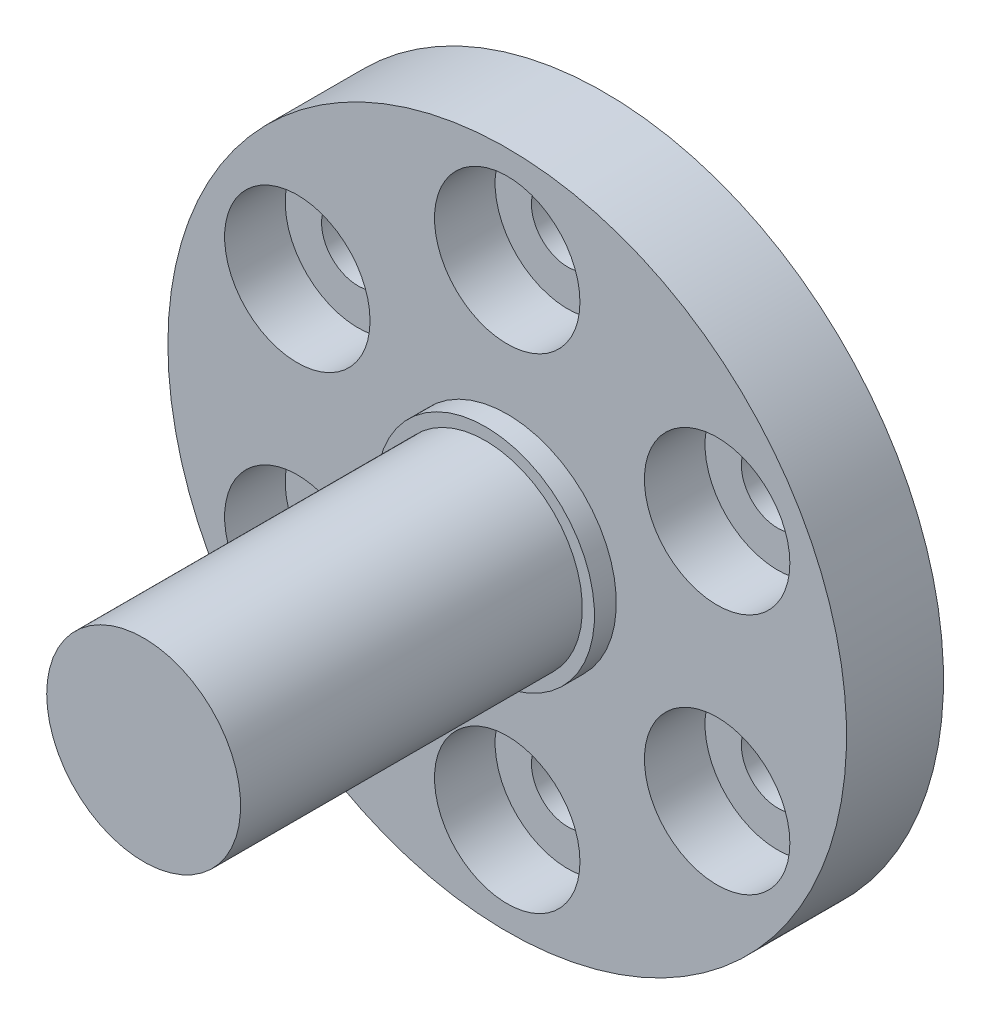
ISO-10303-21;
HEADER;
FILE_DESCRIPTION(('STEP AP214'),'2;1');
FILE_NAME('part.step','',(''),(''),'','','');
FILE_SCHEMA(('AUTOMOTIVE_DESIGN { 1 0 10303 214 1 1 1 1 }'));
ENDSEC;
DATA;
#1=APPLICATION_CONTEXT('core data for automotive mechanical design processes');
#2=APPLICATION_PROTOCOL_DEFINITION('international standard','automotive_design',2000,#1);
#3=PRODUCT_CONTEXT('',#1,'mechanical');
#4=PRODUCT('Part','Part','',(#3));
#5=PRODUCT_RELATED_PRODUCT_CATEGORY('part','',(#4));
#6=PRODUCT_DEFINITION_FORMATION('','',#4);
#7=PRODUCT_DEFINITION_CONTEXT('part definition',#1,'design');
#8=PRODUCT_DEFINITION('design','',#6,#7);
#9=PRODUCT_DEFINITION_SHAPE('','',#8);
#10=(LENGTH_UNIT() NAMED_UNIT(*) SI_UNIT(.MILLI.,.METRE.));
#11=(NAMED_UNIT(*) PLANE_ANGLE_UNIT() SI_UNIT($,.RADIAN.));
#12=(NAMED_UNIT(*) SI_UNIT($,.STERADIAN.) SOLID_ANGLE_UNIT());
#13=UNCERTAINTY_MEASURE_WITH_UNIT(LENGTH_MEASURE(1.E-05),#10,'distance_accuracy_value','');
#14=(GEOMETRIC_REPRESENTATION_CONTEXT(3) GLOBAL_UNCERTAINTY_ASSIGNED_CONTEXT((#13)) GLOBAL_UNIT_ASSIGNED_CONTEXT((#10,
#11,#12)) REPRESENTATION_CONTEXT('',''));
#15=CARTESIAN_POINT('',(0.,0.,0.));
#16=DIRECTION('',(0.,0.,1.));
#17=DIRECTION('',(1.,0.,0.));
#18=AXIS2_PLACEMENT_3D('',#15,#16,#17);
#19=CARTESIAN_POINT('',(0.,0.,19.));
#20=DIRECTION('',(0.,0.,1.));
#21=DIRECTION('',(1.,0.,0.));
#22=AXIS2_PLACEMENT_3D('',#19,#20,#21);
#23=PLANE('',#22);
#24=CARTESIAN_POINT('',(0.,0.,19.));
#25=DIRECTION('',(0.,0.,-1.));
#26=DIRECTION('',(-1.,0.,0.));
#27=AXIS2_PLACEMENT_3D('',#24,#25,#26);
#28=CIRCLE('',#27,4.);
#29=CARTESIAN_POINT('',(-4.,0.,19.));
#30=VERTEX_POINT('',#29);
#31=EDGE_CURVE('E18',#30,#30,#28,.T.);
#32=ORIENTED_EDGE('',*,*,#31,.F.);
#33=EDGE_LOOP('',(#32));
#34=FACE_BOUND('',#33,.T.);
#35=ADVANCED_FACE('F15',(#34),#23,.T.);
#36=CARTESIAN_POINT('',(0.,0.,19.));
#37=DIRECTION('',(0.,0.,-1.));
#38=DIRECTION('',(-1.,0.,0.));
#39=AXIS2_PLACEMENT_3D('',#36,#37,#38);
#40=CYLINDRICAL_SURFACE('',#39,4.);
#41=CARTESIAN_POINT('',(0.,0.,4.9));
#42=DIRECTION('',(0.,0.,-1.));
#43=DIRECTION('',(-1.,0.,0.));
#44=AXIS2_PLACEMENT_3D('',#41,#42,#43);
#45=CIRCLE('',#44,4.);
#46=CARTESIAN_POINT('',(-4.,0.,4.9));
#47=VERTEX_POINT('',#46);
#48=EDGE_CURVE('E106',#47,#47,#45,.T.);
#49=ORIENTED_EDGE('',*,*,#48,.F.);
#50=EDGE_LOOP('',(#49));
#51=FACE_BOUND('',#50,.T.);
#52=ORIENTED_EDGE('',*,*,#31,.T.);
#53=EDGE_LOOP('',(#52));
#54=FACE_BOUND('',#53,.T.);
#55=ADVANCED_FACE('F113',(#51,#54),#40,.T.);
#56=CARTESIAN_POINT('',(0.,0.,4.9));
#57=DIRECTION('',(0.,0.,1.));
#58=DIRECTION('',(1.,0.,0.));
#59=AXIS2_PLACEMENT_3D('',#56,#57,#58);
#60=PLANE('',#59);
#61=CARTESIAN_POINT('',(0.,0.,4.9));
#62=DIRECTION('',(0.,0.,-1.));
#63=DIRECTION('',(-1.,0.,0.));
#64=AXIS2_PLACEMENT_3D('',#61,#62,#63);
#65=CIRCLE('',#64,4.5);
#66=CARTESIAN_POINT('',(-4.5,0.,4.9));
#67=VERTEX_POINT('',#66);
#68=EDGE_CURVE('E104',#67,#67,#65,.T.);
#69=ORIENTED_EDGE('',*,*,#68,.F.);
#70=EDGE_LOOP('',(#69));
#71=FACE_BOUND('',#70,.T.);
#72=ORIENTED_EDGE('',*,*,#48,.T.);
#73=EDGE_LOOP('',(#72));
#74=FACE_BOUND('',#73,.T.);
#75=ADVANCED_FACE('F120',(#71,#74),#60,.T.);
#76=CARTESIAN_POINT('',(-8.66025403784433,5.0000000000001,1.5));
#77=DIRECTION('',(0.,0.,1.));
#78=DIRECTION('',(1.,0.,0.));
#79=AXIS2_PLACEMENT_3D('',#76,#77,#78);
#80=CYLINDRICAL_SURFACE('',#79,3.);
#81=CARTESIAN_POINT('',(-8.66025403784433,5.0000000000001,4.));
#82=DIRECTION('',(0.,0.,1.));
#83=DIRECTION('',(1.,0.,0.));
#84=AXIS2_PLACEMENT_3D('',#81,#82,#83);
#85=CIRCLE('',#84,3.);
#86=CARTESIAN_POINT('',(-5.66025403784433,5.0000000000001,4.));
#87=VERTEX_POINT('',#86);
#88=EDGE_CURVE('E83',#87,#87,#85,.F.);
#89=ORIENTED_EDGE('',*,*,#88,.F.);
#90=EDGE_LOOP('',(#89));
#91=FACE_BOUND('',#90,.T.);
#92=CARTESIAN_POINT('',(-8.66025403784433,5.0000000000001,1.5));
#93=DIRECTION('',(0.,0.,1.));
#94=DIRECTION('',(1.,0.,0.));
#95=AXIS2_PLACEMENT_3D('',#92,#93,#94);
#96=CIRCLE('',#95,3.);
#97=CARTESIAN_POINT('',(-5.66025403784433,5.0000000000001,1.5));
#98=VERTEX_POINT('',#97);
#99=EDGE_CURVE('E86',#98,#98,#96,.T.);
#100=ORIENTED_EDGE('',*,*,#99,.F.);
#101=EDGE_LOOP('',(#100));
#102=FACE_BOUND('',#101,.T.);
#103=ADVANCED_FACE('F209',(#91,#102),#80,.F.);
#104=CARTESIAN_POINT('',(-8.66025403784443,-4.99999999999992,1.5));
#105=DIRECTION('',(0.,0.,1.));
#106=DIRECTION('',(1.,0.,0.));
#107=AXIS2_PLACEMENT_3D('',#104,#105,#106);
#108=CYLINDRICAL_SURFACE('',#107,3.);
#109=CARTESIAN_POINT('',(-8.66025403784443,-4.99999999999992,4.));
#110=DIRECTION('',(0.,0.,1.));
#111=DIRECTION('',(1.,0.,0.));
#112=AXIS2_PLACEMENT_3D('',#109,#110,#111);
#113=CIRCLE('',#112,3.);
#114=CARTESIAN_POINT('',(-5.66025403784443,-4.99999999999992,4.));
#115=VERTEX_POINT('',#114);
#116=EDGE_CURVE('E80',#115,#115,#113,.F.);
#117=ORIENTED_EDGE('',*,*,#116,.F.);
#118=EDGE_LOOP('',(#117));
#119=FACE_BOUND('',#118,.T.);
#120=CARTESIAN_POINT('',(-8.66025403784443,-4.99999999999992,1.5));
#121=DIRECTION('',(0.,0.,1.));
#122=DIRECTION('',(1.,0.,0.));
#123=AXIS2_PLACEMENT_3D('',#120,#121,#122);
#124=CIRCLE('',#123,3.);
#125=CARTESIAN_POINT('',(-5.66025403784443,-4.99999999999992,1.5));
#126=VERTEX_POINT('',#125);
#127=EDGE_CURVE('E101',#126,#126,#124,.T.);
#128=ORIENTED_EDGE('',*,*,#127,.F.);
#129=EDGE_LOOP('',(#128));
#130=FACE_BOUND('',#129,.T.);
#131=ADVANCED_FACE('F205',(#119,#130),#108,.F.);
#132=CARTESIAN_POINT('',(0.,-10.,1.5));
#133=DIRECTION('',(0.,0.,1.));
#134=DIRECTION('',(1.,0.,0.));
#135=AXIS2_PLACEMENT_3D('',#132,#133,#134);
#136=CYLINDRICAL_SURFACE('',#135,3.);
#137=CARTESIAN_POINT('',(0.,-10.,4.));
#138=DIRECTION('',(0.,0.,1.));
#139=DIRECTION('',(1.,0.,0.));
#140=AXIS2_PLACEMENT_3D('',#137,#138,#139);
#141=CIRCLE('',#140,3.);
#142=CARTESIAN_POINT('',(3.,-10.,4.));
#143=VERTEX_POINT('',#142);
#144=EDGE_CURVE('E77',#143,#143,#141,.F.);
#145=ORIENTED_EDGE('',*,*,#144,.F.);
#146=EDGE_LOOP('',(#145));
#147=FACE_BOUND('',#146,.T.);
#148=CARTESIAN_POINT('',(0.,-10.,1.5));
#149=DIRECTION('',(0.,0.,1.));
#150=DIRECTION('',(1.,0.,0.));
#151=AXIS2_PLACEMENT_3D('',#148,#149,#150);
#152=CIRCLE('',#151,3.);
#153=CARTESIAN_POINT('',(3.,-10.,1.5));
#154=VERTEX_POINT('',#153);
#155=EDGE_CURVE('E98',#154,#154,#152,.T.);
#156=ORIENTED_EDGE('',*,*,#155,.F.);
#157=EDGE_LOOP('',(#156));
#158=FACE_BOUND('',#157,.T.);
#159=ADVANCED_FACE('F201',(#147,#158),#136,.F.);
#160=CARTESIAN_POINT('',(8.66025403784436,-5.00000000000004,1.5));
#161=DIRECTION('',(0.,0.,1.));
#162=DIRECTION('',(1.,0.,0.));
#163=AXIS2_PLACEMENT_3D('',#160,#161,#162);
#164=CYLINDRICAL_SURFACE('',#163,3.);
#165=CARTESIAN_POINT('',(8.66025403784436,-5.00000000000004,4.));
#166=DIRECTION('',(0.,0.,1.));
#167=DIRECTION('',(1.,0.,0.));
#168=AXIS2_PLACEMENT_3D('',#165,#166,#167);
#169=CIRCLE('',#168,3.);
#170=CARTESIAN_POINT('',(11.6602540378444,-5.00000000000004,4.));
#171=VERTEX_POINT('',#170);
#172=EDGE_CURVE('E74',#171,#171,#169,.F.);
#173=ORIENTED_EDGE('',*,*,#172,.F.);
#174=EDGE_LOOP('',(#173));
#175=FACE_BOUND('',#174,.T.);
#176=CARTESIAN_POINT('',(8.66025403784436,-5.00000000000004,1.5));
#177=DIRECTION('',(0.,0.,1.));
#178=DIRECTION('',(1.,0.,0.));
#179=AXIS2_PLACEMENT_3D('',#176,#177,#178);
#180=CIRCLE('',#179,3.);
#181=CARTESIAN_POINT('',(11.6602540378444,-5.00000000000004,1.5));
#182=VERTEX_POINT('',#181);
#183=EDGE_CURVE('E95',#182,#182,#180,.T.);
#184=ORIENTED_EDGE('',*,*,#183,.F.);
#185=EDGE_LOOP('',(#184));
#186=FACE_BOUND('',#185,.T.);
#187=ADVANCED_FACE('F197',(#175,#186),#164,.F.);
#188=CARTESIAN_POINT('',(8.6602540378444,4.99999999999998,1.5));
#189=DIRECTION('',(0.,0.,1.));
#190=DIRECTION('',(1.,0.,0.));
#191=AXIS2_PLACEMENT_3D('',#188,#189,#190);
#192=CYLINDRICAL_SURFACE('',#191,3.);
#193=CARTESIAN_POINT('',(8.6602540378444,4.99999999999998,4.));
#194=DIRECTION('',(0.,0.,1.));
#195=DIRECTION('',(1.,0.,0.));
#196=AXIS2_PLACEMENT_3D('',#193,#194,#195);
#197=CIRCLE('',#196,3.);
#198=CARTESIAN_POINT('',(11.6602540378444,4.99999999999998,4.));
#199=VERTEX_POINT('',#198);
#200=EDGE_CURVE('E71',#199,#199,#197,.F.);
#201=ORIENTED_EDGE('',*,*,#200,.F.);
#202=EDGE_LOOP('',(#201));
#203=FACE_BOUND('',#202,.T.);
#204=CARTESIAN_POINT('',(8.6602540378444,4.99999999999998,1.5));
#205=DIRECTION('',(0.,0.,1.));
#206=DIRECTION('',(1.,0.,0.));
#207=AXIS2_PLACEMENT_3D('',#204,#205,#206);
#208=CIRCLE('',#207,3.);
#209=CARTESIAN_POINT('',(11.6602540378444,4.99999999999998,1.5));
#210=VERTEX_POINT('',#209);
#211=EDGE_CURVE('E92',#210,#210,#208,.T.);
#212=ORIENTED_EDGE('',*,*,#211,.F.);
#213=EDGE_LOOP('',(#212));
#214=FACE_BOUND('',#213,.T.);
#215=ADVANCED_FACE('F193',(#203,#214),#192,.F.);
#216=CARTESIAN_POINT('',(0.,10.,1.5));
#217=DIRECTION('',(0.,0.,1.));
#218=DIRECTION('',(1.,0.,0.));
#219=AXIS2_PLACEMENT_3D('',#216,#217,#218);
#220=CYLINDRICAL_SURFACE('',#219,3.);
#221=CARTESIAN_POINT('',(0.,10.,4.));
#222=DIRECTION('',(0.,0.,1.));
#223=DIRECTION('',(1.,0.,0.));
#224=AXIS2_PLACEMENT_3D('',#221,#222,#223);
#225=CIRCLE('',#224,3.);
#226=CARTESIAN_POINT('',(3.,10.,4.));
#227=VERTEX_POINT('',#226);
#228=EDGE_CURVE('E68',#227,#227,#225,.F.);
#229=ORIENTED_EDGE('',*,*,#228,.F.);
#230=EDGE_LOOP('',(#229));
#231=FACE_BOUND('',#230,.T.);
#232=CARTESIAN_POINT('',(0.,10.,1.5));
#233=DIRECTION('',(0.,0.,1.));
#234=DIRECTION('',(1.,0.,0.));
#235=AXIS2_PLACEMENT_3D('',#232,#233,#234);
#236=CIRCLE('',#235,3.);
#237=CARTESIAN_POINT('',(3.,10.,1.5));
#238=VERTEX_POINT('',#237);
#239=EDGE_CURVE('E89',#238,#238,#236,.T.);
#240=ORIENTED_EDGE('',*,*,#239,.F.);
#241=EDGE_LOOP('',(#240));
#242=FACE_BOUND('',#241,.T.);
#243=ADVANCED_FACE('F189',(#231,#242),#220,.F.);
#244=CARTESIAN_POINT('',(0.,0.,4.9));
#245=DIRECTION('',(0.,0.,-1.));
#246=DIRECTION('',(-1.,0.,0.));
#247=AXIS2_PLACEMENT_3D('',#244,#245,#246);
#248=CYLINDRICAL_SURFACE('',#247,4.5);
#249=CARTESIAN_POINT('',(0.,0.,4.));
#250=DIRECTION('',(0.,0.,-1.));
#251=DIRECTION('',(-1.,0.,0.));
#252=AXIS2_PLACEMENT_3D('',#249,#250,#251);
#253=CIRCLE('',#252,4.5);
#254=CARTESIAN_POINT('',(-4.5,0.,4.));
#255=VERTEX_POINT('',#254);
#256=EDGE_CURVE('E65',#255,#255,#253,.T.);
#257=ORIENTED_EDGE('',*,*,#256,.F.);
#258=EDGE_LOOP('',(#257));
#259=FACE_BOUND('',#258,.T.);
#260=ORIENTED_EDGE('',*,*,#68,.T.);
#261=EDGE_LOOP('',(#260));
#262=FACE_BOUND('',#261,.T.);
#263=ADVANCED_FACE('F185',(#259,#262),#248,.T.);
#264=CARTESIAN_POINT('',(-8.66025403784443,-4.99999999999992,1.5));
#265=DIRECTION('',(0.,0.,1.));
#266=DIRECTION('',(1.,0.,0.));
#267=AXIS2_PLACEMENT_3D('',#264,#265,#266);
#268=PLANE('',#267);
#269=ORIENTED_EDGE('',*,*,#127,.T.);
#270=EDGE_LOOP('',(#269));
#271=FACE_BOUND('',#270,.T.);
#272=CARTESIAN_POINT('',(-8.66025403784353,-5.00000000000049,1.5));
#273=DIRECTION('',(0.,0.,-1.));
#274=DIRECTION('',(-1.,0.,0.));
#275=AXIS2_PLACEMENT_3D('',#272,#273,#274);
#276=CIRCLE('',#275,1.50000000000105);
#277=CARTESIAN_POINT('',(-10.1602540378446,-5.00000000000049,1.5));
#278=VERTEX_POINT('',#277);
#279=EDGE_CURVE('E62',#278,#278,#276,.T.);
#280=ORIENTED_EDGE('',*,*,#279,.T.);
#281=EDGE_LOOP('',(#280));
#282=FACE_BOUND('',#281,.T.);
#283=ADVANCED_FACE('F181',(#271,#282),#268,.T.);
#284=CARTESIAN_POINT('',(0.,-10.,1.5));
#285=DIRECTION('',(0.,0.,1.));
#286=DIRECTION('',(1.,0.,0.));
#287=AXIS2_PLACEMENT_3D('',#284,#285,#286);
#288=PLANE('',#287);
#289=ORIENTED_EDGE('',*,*,#155,.T.);
#290=EDGE_LOOP('',(#289));
#291=FACE_BOUND('',#290,.T.);
#292=CARTESIAN_POINT('',(1.13319443681872E-12,-10.,1.5));
#293=DIRECTION('',(0.,0.,-1.));
#294=DIRECTION('',(-1.,0.,0.));
#295=AXIS2_PLACEMENT_3D('',#292,#293,#294);
#296=CIRCLE('',#295,1.50000000000115);
#297=CARTESIAN_POINT('',(-1.50000000000002,-10.,1.5));
#298=VERTEX_POINT('',#297);
#299=EDGE_CURVE('E59',#298,#298,#296,.T.);
#300=ORIENTED_EDGE('',*,*,#299,.T.);
#301=EDGE_LOOP('',(#300));
#302=FACE_BOUND('',#301,.T.);
#303=ADVANCED_FACE('F177',(#291,#302),#288,.T.);
#304=CARTESIAN_POINT('',(8.66025403784436,-5.00000000000004,1.5));
#305=DIRECTION('',(0.,0.,1.));
#306=DIRECTION('',(1.,0.,0.));
#307=AXIS2_PLACEMENT_3D('',#304,#305,#306);
#308=PLANE('',#307);
#309=ORIENTED_EDGE('',*,*,#183,.T.);
#310=EDGE_LOOP('',(#309));
#311=FACE_BOUND('',#310,.T.);
#312=CARTESIAN_POINT('',(8.66025403784524,-4.99999999999951,1.5));
#313=DIRECTION('',(0.,0.,-1.));
#314=DIRECTION('',(-1.,0.,0.));
#315=AXIS2_PLACEMENT_3D('',#312,#313,#314);
#316=CIRCLE('',#315,1.50000000000071);
#317=CARTESIAN_POINT('',(7.16025403784452,-4.99999999999951,1.5));
#318=VERTEX_POINT('',#317);
#319=EDGE_CURVE('E56',#318,#318,#316,.T.);
#320=ORIENTED_EDGE('',*,*,#319,.T.);
#321=EDGE_LOOP('',(#320));
#322=FACE_BOUND('',#321,.T.);
#323=ADVANCED_FACE('F173',(#311,#322),#308,.T.);
#324=CARTESIAN_POINT('',(8.6602540378444,4.99999999999998,1.5));
#325=DIRECTION('',(0.,0.,1.));
#326=DIRECTION('',(1.,0.,0.));
#327=AXIS2_PLACEMENT_3D('',#324,#325,#326);
#328=PLANE('',#327);
#329=ORIENTED_EDGE('',*,*,#211,.T.);
#330=EDGE_LOOP('',(#329));
#331=FACE_BOUND('',#330,.T.);
#332=CARTESIAN_POINT('',(8.66025403784467,5.00000000000049,1.5));
#333=DIRECTION('',(0.,0.,-1.));
#334=DIRECTION('',(-1.,0.,0.));
#335=AXIS2_PLACEMENT_3D('',#332,#333,#334);
#336=CIRCLE('',#335,1.50000000000015);
#337=CARTESIAN_POINT('',(7.16025403784452,5.00000000000049,1.5));
#338=VERTEX_POINT('',#337);
#339=EDGE_CURVE('E53',#338,#338,#336,.T.);
#340=ORIENTED_EDGE('',*,*,#339,.T.);
#341=EDGE_LOOP('',(#340));
#342=FACE_BOUND('',#341,.T.);
#343=ADVANCED_FACE('F169',(#331,#342),#328,.T.);
#344=CARTESIAN_POINT('',(0.,10.,1.5));
#345=DIRECTION('',(0.,0.,1.));
#346=DIRECTION('',(1.,0.,0.));
#347=AXIS2_PLACEMENT_3D('',#344,#345,#346);
#348=PLANE('',#347);
#349=ORIENTED_EDGE('',*,*,#239,.T.);
#350=EDGE_LOOP('',(#349));
#351=FACE_BOUND('',#350,.T.);
#352=CARTESIAN_POINT('',(0.,10.,1.5));
#353=DIRECTION('',(0.,0.,-1.));
#354=DIRECTION('',(-1.,0.,0.));
#355=AXIS2_PLACEMENT_3D('',#352,#353,#354);
#356=CIRCLE('',#355,1.5);
#357=CARTESIAN_POINT('',(-1.5,10.,1.5));
#358=VERTEX_POINT('',#357);
#359=EDGE_CURVE('E50',#358,#358,#356,.T.);
#360=ORIENTED_EDGE('',*,*,#359,.T.);
#361=EDGE_LOOP('',(#360));
#362=FACE_BOUND('',#361,.T.);
#363=ADVANCED_FACE('F165',(#351,#362),#348,.T.);
#364=CARTESIAN_POINT('',(-8.66025403784433,5.0000000000001,1.5));
#365=DIRECTION('',(0.,0.,1.));
#366=DIRECTION('',(1.,0.,0.));
#367=AXIS2_PLACEMENT_3D('',#364,#365,#366);
#368=PLANE('',#367);
#369=ORIENTED_EDGE('',*,*,#99,.T.);
#370=EDGE_LOOP('',(#369));
#371=FACE_BOUND('',#370,.T.);
#372=CARTESIAN_POINT('',(-8.66025403784411,4.9999999999995,1.5));
#373=DIRECTION('',(0.,0.,-1.));
#374=DIRECTION('',(-1.,0.,0.));
#375=AXIS2_PLACEMENT_3D('',#372,#373,#374);
#376=CIRCLE('',#375,1.50000000000053);
#377=CARTESIAN_POINT('',(-10.1602540378446,4.9999999999995,1.5));
#378=VERTEX_POINT('',#377);
#379=EDGE_CURVE('E47',#378,#378,#376,.T.);
#380=ORIENTED_EDGE('',*,*,#379,.T.);
#381=EDGE_LOOP('',(#380));
#382=FACE_BOUND('',#381,.T.);
#383=ADVANCED_FACE('F161',(#371,#382),#368,.T.);
#384=CARTESIAN_POINT('',(0.,0.,4.));
#385=DIRECTION('',(0.,0.,1.));
#386=DIRECTION('',(1.,0.,0.));
#387=AXIS2_PLACEMENT_3D('',#384,#385,#386);
#388=PLANE('',#387);
#389=CARTESIAN_POINT('',(0.,0.,4.));
#390=DIRECTION('',(0.,0.,-1.));
#391=DIRECTION('',(-1.,0.,0.));
#392=AXIS2_PLACEMENT_3D('',#389,#390,#391);
#393=CIRCLE('',#392,14.);
#394=CARTESIAN_POINT('',(-14.,0.,4.));
#395=VERTEX_POINT('',#394);
#396=EDGE_CURVE('E44',#395,#395,#393,.T.);
#397=ORIENTED_EDGE('',*,*,#396,.F.);
#398=EDGE_LOOP('',(#397));
#399=FACE_BOUND('',#398,.T.);
#400=ORIENTED_EDGE('',*,*,#256,.T.);
#401=EDGE_LOOP('',(#400));
#402=FACE_BOUND('',#401,.T.);
#403=ORIENTED_EDGE('',*,*,#228,.T.);
#404=EDGE_LOOP('',(#403));
#405=FACE_BOUND('',#404,.T.);
#406=ORIENTED_EDGE('',*,*,#200,.T.);
#407=EDGE_LOOP('',(#406));
#408=FACE_BOUND('',#407,.T.);
#409=ORIENTED_EDGE('',*,*,#172,.T.);
#410=EDGE_LOOP('',(#409));
#411=FACE_BOUND('',#410,.T.);
#412=ORIENTED_EDGE('',*,*,#144,.T.);
#413=EDGE_LOOP('',(#412));
#414=FACE_BOUND('',#413,.T.);
#415=ORIENTED_EDGE('',*,*,#116,.T.);
#416=EDGE_LOOP('',(#415));
#417=FACE_BOUND('',#416,.T.);
#418=ORIENTED_EDGE('',*,*,#88,.T.);
#419=EDGE_LOOP('',(#418));
#420=FACE_BOUND('',#419,.T.);
#421=ADVANCED_FACE('F157',(#399,#402,#405,#408,#411,#414,#417,#420),#388,.T.);
#422=CARTESIAN_POINT('',(-8.66025403784353,-5.00000000000049,4.));
#423=DIRECTION('',(0.,0.,-1.));
#424=DIRECTION('',(-1.,0.,0.));
#425=AXIS2_PLACEMENT_3D('',#422,#423,#424);
#426=CYLINDRICAL_SURFACE('',#425,1.50000000000105);
#427=CARTESIAN_POINT('',(-8.66025403784353,-5.00000000000049,0.));
#428=DIRECTION('',(0.,0.,-1.));
#429=DIRECTION('',(-1.,0.,0.));
#430=AXIS2_PLACEMENT_3D('',#427,#428,#429);
#431=CIRCLE('',#430,1.50000000000105);
#432=CARTESIAN_POINT('',(-10.1602540378446,-5.00000000000049,0.));
#433=VERTEX_POINT('',#432);
#434=EDGE_CURVE('E41',#433,#433,#431,.T.);
#435=ORIENTED_EDGE('',*,*,#434,.T.);
#436=EDGE_LOOP('',(#435));
#437=FACE_BOUND('',#436,.T.);
#438=ORIENTED_EDGE('',*,*,#279,.F.);
#439=EDGE_LOOP('',(#438));
#440=FACE_BOUND('',#439,.T.);
#441=ADVANCED_FACE('F153',(#437,#440),#426,.F.);
#442=CARTESIAN_POINT('',(1.13319443681872E-12,-10.,4.));
#443=DIRECTION('',(0.,0.,-1.));
#444=DIRECTION('',(-1.,0.,0.));
#445=AXIS2_PLACEMENT_3D('',#442,#443,#444);
#446=CYLINDRICAL_SURFACE('',#445,1.50000000000115);
#447=CARTESIAN_POINT('',(1.13319443681872E-12,-10.,0.));
#448=DIRECTION('',(0.,0.,-1.));
#449=DIRECTION('',(-1.,0.,0.));
#450=AXIS2_PLACEMENT_3D('',#447,#448,#449);
#451=CIRCLE('',#450,1.50000000000115);
#452=CARTESIAN_POINT('',(-1.50000000000002,-10.,0.));
#453=VERTEX_POINT('',#452);
#454=EDGE_CURVE('E38',#453,#453,#451,.T.);
#455=ORIENTED_EDGE('',*,*,#454,.T.);
#456=EDGE_LOOP('',(#455));
#457=FACE_BOUND('',#456,.T.);
#458=ORIENTED_EDGE('',*,*,#299,.F.);
#459=EDGE_LOOP('',(#458));
#460=FACE_BOUND('',#459,.T.);
#461=ADVANCED_FACE('F149',(#457,#460),#446,.F.);
#462=CARTESIAN_POINT('',(8.66025403784524,-4.99999999999951,4.));
#463=DIRECTION('',(0.,0.,-1.));
#464=DIRECTION('',(-1.,0.,0.));
#465=AXIS2_PLACEMENT_3D('',#462,#463,#464);
#466=CYLINDRICAL_SURFACE('',#465,1.50000000000071);
#467=CARTESIAN_POINT('',(8.66025403784524,-4.99999999999951,0.));
#468=DIRECTION('',(0.,0.,-1.));
#469=DIRECTION('',(-1.,0.,0.));
#470=AXIS2_PLACEMENT_3D('',#467,#468,#469);
#471=CIRCLE('',#470,1.50000000000071);
#472=CARTESIAN_POINT('',(7.16025403784452,-4.99999999999951,0.));
#473=VERTEX_POINT('',#472);
#474=EDGE_CURVE('E35',#473,#473,#471,.T.);
#475=ORIENTED_EDGE('',*,*,#474,.T.);
#476=EDGE_LOOP('',(#475));
#477=FACE_BOUND('',#476,.T.);
#478=ORIENTED_EDGE('',*,*,#319,.F.);
#479=EDGE_LOOP('',(#478));
#480=FACE_BOUND('',#479,.T.);
#481=ADVANCED_FACE('F145',(#477,#480),#466,.F.);
#482=CARTESIAN_POINT('',(8.66025403784467,5.00000000000049,4.));
#483=DIRECTION('',(0.,0.,-1.));
#484=DIRECTION('',(-1.,0.,0.));
#485=AXIS2_PLACEMENT_3D('',#482,#483,#484);
#486=CYLINDRICAL_SURFACE('',#485,1.50000000000015);
#487=CARTESIAN_POINT('',(8.66025403784467,5.00000000000049,0.));
#488=DIRECTION('',(0.,0.,-1.));
#489=DIRECTION('',(-1.,0.,0.));
#490=AXIS2_PLACEMENT_3D('',#487,#488,#489);
#491=CIRCLE('',#490,1.50000000000015);
#492=CARTESIAN_POINT('',(7.16025403784452,5.00000000000049,0.));
#493=VERTEX_POINT('',#492);
#494=EDGE_CURVE('E32',#493,#493,#491,.T.);
#495=ORIENTED_EDGE('',*,*,#494,.T.);
#496=EDGE_LOOP('',(#495));
#497=FACE_BOUND('',#496,.T.);
#498=ORIENTED_EDGE('',*,*,#339,.F.);
#499=EDGE_LOOP('',(#498));
#500=FACE_BOUND('',#499,.T.);
#501=ADVANCED_FACE('F141',(#497,#500),#486,.F.);
#502=CARTESIAN_POINT('',(0.,10.,4.));
#503=DIRECTION('',(0.,0.,-1.));
#504=DIRECTION('',(-1.,0.,0.));
#505=AXIS2_PLACEMENT_3D('',#502,#503,#504);
#506=CYLINDRICAL_SURFACE('',#505,1.5);
#507=CARTESIAN_POINT('',(0.,10.,0.));
#508=DIRECTION('',(0.,0.,-1.));
#509=DIRECTION('',(-1.,0.,0.));
#510=AXIS2_PLACEMENT_3D('',#507,#508,#509);
#511=CIRCLE('',#510,1.5);
#512=CARTESIAN_POINT('',(-1.5,10.,0.));
#513=VERTEX_POINT('',#512);
#514=EDGE_CURVE('E27',#513,#513,#511,.T.);
#515=ORIENTED_EDGE('',*,*,#514,.T.);
#516=EDGE_LOOP('',(#515));
#517=FACE_BOUND('',#516,.T.);
#518=ORIENTED_EDGE('',*,*,#359,.F.);
#519=EDGE_LOOP('',(#518));
#520=FACE_BOUND('',#519,.T.);
#521=ADVANCED_FACE('F137',(#517,#520),#506,.F.);
#522=CARTESIAN_POINT('',(-8.66025403784411,4.9999999999995,4.));
#523=DIRECTION('',(0.,0.,-1.));
#524=DIRECTION('',(-1.,0.,0.));
#525=AXIS2_PLACEMENT_3D('',#522,#523,#524);
#526=CYLINDRICAL_SURFACE('',#525,1.50000000000053);
#527=CARTESIAN_POINT('',(-8.66025403784411,4.9999999999995,0.));
#528=DIRECTION('',(0.,0.,-1.));
#529=DIRECTION('',(-1.,0.,0.));
#530=AXIS2_PLACEMENT_3D('',#527,#528,#529);
#531=CIRCLE('',#530,1.50000000000053);
#532=CARTESIAN_POINT('',(-10.1602540378446,4.9999999999995,0.));
#533=VERTEX_POINT('',#532);
#534=EDGE_CURVE('E22',#533,#533,#531,.T.);
#535=ORIENTED_EDGE('',*,*,#534,.T.);
#536=EDGE_LOOP('',(#535));
#537=FACE_BOUND('',#536,.T.);
#538=ORIENTED_EDGE('',*,*,#379,.F.);
#539=EDGE_LOOP('',(#538));
#540=FACE_BOUND('',#539,.T.);
#541=ADVANCED_FACE('F130',(#537,#540),#526,.F.);
#542=CARTESIAN_POINT('',(0.,0.,4.));
#543=DIRECTION('',(0.,0.,-1.));
#544=DIRECTION('',(-1.,0.,0.));
#545=AXIS2_PLACEMENT_3D('',#542,#543,#544);
#546=CYLINDRICAL_SURFACE('',#545,14.);
#547=ORIENTED_EDGE('',*,*,#396,.T.);
#548=EDGE_LOOP('',(#547));
#549=FACE_BOUND('',#548,.T.);
#550=CARTESIAN_POINT('',(0.,0.,0.));
#551=DIRECTION('',(0.,0.,-1.));
#552=DIRECTION('',(-1.,0.,0.));
#553=AXIS2_PLACEMENT_3D('',#550,#551,#552);
#554=CIRCLE('',#553,14.);
#555=CARTESIAN_POINT('',(-14.,0.,0.));
#556=VERTEX_POINT('',#555);
#557=EDGE_CURVE('E10',#556,#556,#554,.F.);
#558=ORIENTED_EDGE('',*,*,#557,.T.);
#559=EDGE_LOOP('',(#558));
#560=FACE_BOUND('',#559,.T.);
#561=ADVANCED_FACE('F124',(#549,#560),#546,.T.);
#562=CARTESIAN_POINT('',(0.,0.,0.));
#563=DIRECTION('',(0.,0.,1.));
#564=DIRECTION('',(1.,0.,0.));
#565=AXIS2_PLACEMENT_3D('',#562,#563,#564);
#566=PLANE('',#565);
#567=ORIENTED_EDGE('',*,*,#557,.F.);
#568=EDGE_LOOP('',(#567));
#569=FACE_BOUND('',#568,.T.);
#570=ORIENTED_EDGE('',*,*,#534,.F.);
#571=EDGE_LOOP('',(#570));
#572=FACE_BOUND('',#571,.T.);
#573=ORIENTED_EDGE('',*,*,#514,.F.);
#574=EDGE_LOOP('',(#573));
#575=FACE_BOUND('',#574,.T.);
#576=ORIENTED_EDGE('',*,*,#494,.F.);
#577=EDGE_LOOP('',(#576));
#578=FACE_BOUND('',#577,.T.);
#579=ORIENTED_EDGE('',*,*,#474,.F.);
#580=EDGE_LOOP('',(#579));
#581=FACE_BOUND('',#580,.T.);
#582=ORIENTED_EDGE('',*,*,#454,.F.);
#583=EDGE_LOOP('',(#582));
#584=FACE_BOUND('',#583,.T.);
#585=ORIENTED_EDGE('',*,*,#434,.F.);
#586=EDGE_LOOP('',(#585));
#587=FACE_BOUND('',#586,.T.);
#588=ADVANCED_FACE('F122',(#569,#572,#575,#578,#581,#584,#587),#566,.F.);
#589=CLOSED_SHELL('',(#35,#55,#75,#103,#131,#159,#187,#215,#243,#263,#283,#303,#323,#343,#363,
#383,#421,#441,#461,#481,#501,#521,#541,#561,#588));
#590=MANIFOLD_SOLID_BREP('B1',#589);
#591=ADVANCED_BREP_SHAPE_REPRESENTATION('',(#18,#590),#14);
#592=SHAPE_DEFINITION_REPRESENTATION(#9,#591);
ENDSEC;
END-ISO-10303-21;
